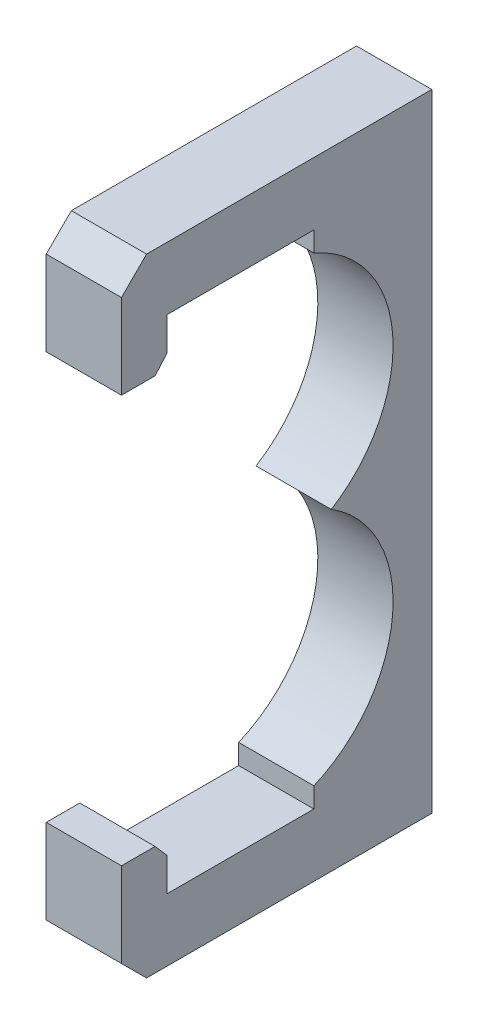
ISO-10303-21;
HEADER;
FILE_DESCRIPTION(('STEP AP214'),'2;1');
FILE_NAME('part.step','',(''),(''),'','','');
FILE_SCHEMA(('AUTOMOTIVE_DESIGN { 1 0 10303 214 1 1 1 1 }'));
ENDSEC;
DATA;
#1=APPLICATION_CONTEXT('core data for automotive mechanical design processes');
#2=APPLICATION_PROTOCOL_DEFINITION('international standard','automotive_design',2000,#1);
#3=PRODUCT_CONTEXT('',#1,'mechanical');
#4=PRODUCT('Part','Part','',(#3));
#5=PRODUCT_RELATED_PRODUCT_CATEGORY('part','',(#4));
#6=PRODUCT_DEFINITION_FORMATION('','',#4);
#7=PRODUCT_DEFINITION_CONTEXT('part definition',#1,'design');
#8=PRODUCT_DEFINITION('design','',#6,#7);
#9=PRODUCT_DEFINITION_SHAPE('','',#8);
#10=(LENGTH_UNIT() NAMED_UNIT(*) SI_UNIT(.MILLI.,.METRE.));
#11=(NAMED_UNIT(*) PLANE_ANGLE_UNIT() SI_UNIT($,.RADIAN.));
#12=(NAMED_UNIT(*) SI_UNIT($,.STERADIAN.) SOLID_ANGLE_UNIT());
#13=UNCERTAINTY_MEASURE_WITH_UNIT(LENGTH_MEASURE(1.E-05),#10,'distance_accuracy_value','');
#14=(GEOMETRIC_REPRESENTATION_CONTEXT(3) GLOBAL_UNCERTAINTY_ASSIGNED_CONTEXT((#13)) GLOBAL_UNIT_ASSIGNED_CONTEXT((#10,
#11,#12)) REPRESENTATION_CONTEXT('',''));
#15=CARTESIAN_POINT('',(0.,0.,0.));
#16=DIRECTION('',(0.,0.,1.));
#17=DIRECTION('',(1.,0.,0.));
#18=AXIS2_PLACEMENT_3D('',#15,#16,#17);
#19=CARTESIAN_POINT('',(6.,17.688911622081,-65.9487486966033));
#20=DIRECTION('',(0.,0.,1.));
#21=DIRECTION('',(1.,0.,0.));
#22=AXIS2_PLACEMENT_3D('',#19,#20,#21);
#23=PLANE('',#22);
#24=CARTESIAN_POINT('',(2.99999999999999,-29.6225357680315,-65.9487486966033));
#25=DIRECTION('',(0.,0.,-1.));
#26=DIRECTION('',(1.,0.,0.));
#27=AXIS2_PLACEMENT_3D('',#24,#25,#26);
#28=CIRCLE('',#27,1.25);
#29=CARTESIAN_POINT('',(4.24999999999999,-29.6225357680315,-65.9487486966033));
#30=VERTEX_POINT('',#29);
#31=EDGE_CURVE('E354',#30,#30,#28,.T.);
#32=ORIENTED_EDGE('',*,*,#31,.F.);
#33=EDGE_LOOP('',(#32));
#34=FACE_BOUND('',#33,.T.);
#35=CARTESIAN_POINT('',(2.99999999999999,15.188911622081,-65.9487486966033));
#36=DIRECTION('',(0.,0.,-1.));
#37=DIRECTION('',(-1.,0.,0.));
#38=AXIS2_PLACEMENT_3D('',#35,#36,#37);
#39=CIRCLE('',#38,1.25);
#40=CARTESIAN_POINT('',(1.74999999999999,15.188911622081,-65.9487486966033));
#41=VERTEX_POINT('',#40);
#42=EDGE_CURVE('E357',#41,#41,#39,.T.);
#43=ORIENTED_EDGE('',*,*,#42,.F.);
#44=EDGE_LOOP('',(#43));
#45=FACE_BOUND('',#44,.T.);
#46=DIRECTION('',(0.,1.,0.));
#47=VECTOR('',#46,1.);
#48=CARTESIAN_POINT('',(0.,17.688911622081,-65.9487486966033));
#49=LINE('',#48,#47);
#50=CARTESIAN_POINT('',(0.,-32.311088377919,-65.9487486966033));
#51=VERTEX_POINT('',#50);
#52=CARTESIAN_POINT('',(0.,17.688911622081,-65.9487486966033));
#53=VERTEX_POINT('',#52);
#54=EDGE_CURVE('E196',#51,#53,#49,.T.);
#55=ORIENTED_EDGE('',*,*,#54,.T.);
#56=DIRECTION('',(-1.,0.,0.));
#57=VECTOR('',#56,1.);
#58=CARTESIAN_POINT('',(6.,17.688911622081,-65.9487486966033));
#59=LINE('',#58,#57);
#60=CARTESIAN_POINT('',(6.,17.688911622081,-65.9487486966033));
#61=VERTEX_POINT('',#60);
#62=EDGE_CURVE('E11',#61,#53,#59,.T.);
#63=ORIENTED_EDGE('',*,*,#62,.F.);
#64=DIRECTION('',(0.,1.,0.));
#65=VECTOR('',#64,1.);
#66=CARTESIAN_POINT('',(6.,17.688911622081,-65.9487486966033));
#67=LINE('',#66,#65);
#68=CARTESIAN_POINT('',(6.,-32.311088377919,-65.9487486966033));
#69=VERTEX_POINT('',#68);
#70=EDGE_CURVE('E233',#69,#61,#67,.T.);
#71=ORIENTED_EDGE('',*,*,#70,.F.);
#72=DIRECTION('',(-1.,0.,0.));
#73=VECTOR('',#72,1.);
#74=CARTESIAN_POINT('',(6.,-32.311088377919,-65.9487486966033));
#75=LINE('',#74,#73);
#76=EDGE_CURVE('E192',#69,#51,#75,.T.);
#77=ORIENTED_EDGE('',*,*,#76,.T.);
#78=EDGE_LOOP('',(#55,#63,#71,#77));
#79=FACE_BOUND('',#78,.T.);
#80=ADVANCED_FACE('F34',(#34,#45,#79),#23,.F.);
#81=CARTESIAN_POINT('',(6.,17.688911622081,-43.2032051013806));
#82=DIRECTION('',(0.,-1.,0.));
#83=DIRECTION('',(0.,0.,-1.));
#84=AXIS2_PLACEMENT_3D('',#81,#82,#83);
#85=PLANE('',#84);
#86=DIRECTION('',(0.,0.,1.));
#87=VECTOR('',#86,1.);
#88=CARTESIAN_POINT('',(0.,17.688911622081,-43.2032051013806));
#89=LINE('',#88,#87);
#90=CARTESIAN_POINT('',(0.,17.688911622081,-43.2032051013806));
#91=VERTEX_POINT('',#90);
#92=EDGE_CURVE('E199',#53,#91,#89,.T.);
#93=ORIENTED_EDGE('',*,*,#92,.T.);
#94=DIRECTION('',(-1.,0.,0.));
#95=VECTOR('',#94,1.);
#96=CARTESIAN_POINT('',(6.,17.688911622081,-43.2032051013806));
#97=LINE('',#96,#95);
#98=CARTESIAN_POINT('',(6.,17.688911622081,-43.2032051013806));
#99=VERTEX_POINT('',#98);
#100=EDGE_CURVE('E42',#99,#91,#97,.T.);
#101=ORIENTED_EDGE('',*,*,#100,.F.);
#102=DIRECTION('',(0.,0.,1.));
#103=VECTOR('',#102,1.);
#104=CARTESIAN_POINT('',(6.,17.688911622081,-43.2032051013806));
#105=LINE('',#104,#103);
#106=EDGE_CURVE('E126',#61,#99,#105,.T.);
#107=ORIENTED_EDGE('',*,*,#106,.F.);
#108=ORIENTED_EDGE('',*,*,#62,.T.);
#109=EDGE_LOOP('',(#93,#101,#107,#108));
#110=FACE_BOUND('',#109,.T.);
#111=ADVANCED_FACE('F346',(#110),#85,.F.);
#112=CARTESIAN_POINT('',(6.,15.688911622081,-41.2032051013806));
#113=DIRECTION('',(0.,-0.707106781186548,-0.707106781186548));
#114=DIRECTION('',(0.,0.707106781186548,-0.707106781186548));
#115=AXIS2_PLACEMENT_3D('',#112,#113,#114);
#116=PLANE('',#115);
#117=DIRECTION('',(0.,-0.707106781186547,0.707106781186547));
#118=VECTOR('',#117,1.);
#119=CARTESIAN_POINT('',(0.,15.688911622081,-41.2032051013806));
#120=LINE('',#119,#118);
#121=CARTESIAN_POINT('',(0.,15.688911622081,-41.2032051013806));
#122=VERTEX_POINT('',#121);
#123=EDGE_CURVE('E202',#91,#122,#120,.T.);
#124=ORIENTED_EDGE('',*,*,#123,.T.);
#125=DIRECTION('',(-1.,0.,0.));
#126=VECTOR('',#125,1.);
#127=CARTESIAN_POINT('',(6.,15.688911622081,-41.2032051013806));
#128=LINE('',#127,#126);
#129=CARTESIAN_POINT('',(6.,15.688911622081,-41.2032051013806));
#130=VERTEX_POINT('',#129);
#131=EDGE_CURVE('E273',#130,#122,#128,.T.);
#132=ORIENTED_EDGE('',*,*,#131,.F.);
#133=DIRECTION('',(0.,-0.707106781186547,0.707106781186547));
#134=VECTOR('',#133,1.);
#135=CARTESIAN_POINT('',(6.,15.688911622081,-41.2032051013806));
#136=LINE('',#135,#134);
#137=EDGE_CURVE('E281',#99,#130,#136,.T.);
#138=ORIENTED_EDGE('',*,*,#137,.F.);
#139=ORIENTED_EDGE('',*,*,#100,.T.);
#140=EDGE_LOOP('',(#124,#132,#138,#139));
#141=FACE_BOUND('',#140,.T.);
#142=ADVANCED_FACE('F279',(#141),#116,.F.);
#143=CARTESIAN_POINT('',(6.,8.938911622081,-41.2032051013806));
#144=DIRECTION('',(0.,0.,-1.));
#145=DIRECTION('',(-1.,0.,0.));
#146=AXIS2_PLACEMENT_3D('',#143,#144,#145);
#147=PLANE('',#146);
#148=DIRECTION('',(0.,-1.,0.));
#149=VECTOR('',#148,1.);
#150=CARTESIAN_POINT('',(0.,8.938911622081,-41.2032051013806));
#151=LINE('',#150,#149);
#152=CARTESIAN_POINT('',(0.,8.938911622081,-41.2032051013806));
#153=VERTEX_POINT('',#152);
#154=EDGE_CURVE('E204',#122,#153,#151,.T.);
#155=ORIENTED_EDGE('',*,*,#154,.T.);
#156=DIRECTION('',(-1.,0.,0.));
#157=VECTOR('',#156,1.);
#158=CARTESIAN_POINT('',(6.,8.938911622081,-41.2032051013806));
#159=LINE('',#158,#157);
#160=CARTESIAN_POINT('',(6.,8.938911622081,-41.2032051013806));
#161=VERTEX_POINT('',#160);
#162=EDGE_CURVE('E270',#161,#153,#159,.T.);
#163=ORIENTED_EDGE('',*,*,#162,.F.);
#164=DIRECTION('',(0.,-1.,0.));
#165=VECTOR('',#164,1.);
#166=CARTESIAN_POINT('',(6.,8.938911622081,-41.2032051013806));
#167=LINE('',#166,#165);
#168=EDGE_CURVE('E299',#130,#161,#167,.T.);
#169=ORIENTED_EDGE('',*,*,#168,.F.);
#170=ORIENTED_EDGE('',*,*,#131,.T.);
#171=EDGE_LOOP('',(#155,#163,#169,#170));
#172=FACE_BOUND('',#171,.T.);
#173=ADVANCED_FACE('F290',(#172),#147,.F.);
#174=CARTESIAN_POINT('',(6.,8.938911622081,-41.2032051013806));
#175=DIRECTION('',(0.,1.,0.));
#176=DIRECTION('',(0.,0.,1.));
#177=AXIS2_PLACEMENT_3D('',#174,#175,#176);
#178=PLANE('',#177);
#179=DIRECTION('',(0.,0.,-1.));
#180=VECTOR('',#179,1.);
#181=CARTESIAN_POINT('',(0.,8.938911622081,-41.2032051013806));
#182=LINE('',#181,#180);
#183=CARTESIAN_POINT('',(0.,8.938911622081,-43.8801063311501));
#184=VERTEX_POINT('',#183);
#185=EDGE_CURVE('E206',#153,#184,#182,.T.);
#186=ORIENTED_EDGE('',*,*,#185,.T.);
#187=DIRECTION('',(-1.,0.,0.));
#188=VECTOR('',#187,1.);
#189=CARTESIAN_POINT('',(6.,8.938911622081,-43.8801063311501));
#190=LINE('',#189,#188);
#191=CARTESIAN_POINT('',(6.,8.938911622081,-43.8801063311501));
#192=VERTEX_POINT('',#191);
#193=EDGE_CURVE('E267',#192,#184,#190,.T.);
#194=ORIENTED_EDGE('',*,*,#193,.F.);
#195=DIRECTION('',(0.,0.,-1.));
#196=VECTOR('',#195,1.);
#197=CARTESIAN_POINT('',(6.,8.938911622081,-41.2032051013806));
#198=LINE('',#197,#196);
#199=EDGE_CURVE('E296',#161,#192,#198,.T.);
#200=ORIENTED_EDGE('',*,*,#199,.F.);
#201=ORIENTED_EDGE('',*,*,#162,.T.);
#202=EDGE_LOOP('',(#186,#194,#200,#201));
#203=FACE_BOUND('',#202,.T.);
#204=ADVANCED_FACE('F294',(#203),#178,.F.);
#205=CARTESIAN_POINT('',(6.,10.0114106212806,-44.8148552302697));
#206=DIRECTION('',(0.,0.657035261148567,0.753859844803684));
#207=DIRECTION('',(0.,-0.753859844803684,0.657035261148567));
#208=AXIS2_PLACEMENT_3D('',#205,#206,#207);
#209=PLANE('',#208);
#210=DIRECTION('',(0.,0.753859844803684,-0.657035261148567));
#211=VECTOR('',#210,1.);
#212=CARTESIAN_POINT('',(0.,10.0114106212806,-44.8148552302697));
#213=LINE('',#212,#211);
#214=CARTESIAN_POINT('',(0.,10.0114106212806,-44.8148552302697));
#215=VERTEX_POINT('',#214);
#216=EDGE_CURVE('E208',#184,#215,#213,.T.);
#217=ORIENTED_EDGE('',*,*,#216,.T.);
#218=DIRECTION('',(-1.,0.,0.));
#219=VECTOR('',#218,1.);
#220=CARTESIAN_POINT('',(6.,10.0114106212806,-44.8148552302697));
#221=LINE('',#220,#219);
#222=CARTESIAN_POINT('',(6.,10.0114106212806,-44.8148552302697));
#223=VERTEX_POINT('',#222);
#224=EDGE_CURVE('E264',#223,#215,#221,.T.);
#225=ORIENTED_EDGE('',*,*,#224,.F.);
#226=DIRECTION('',(0.,0.753859844803684,-0.657035261148567));
#227=VECTOR('',#226,1.);
#228=CARTESIAN_POINT('',(6.,10.0114106212806,-44.8148552302697));
#229=LINE('',#228,#227);
#230=EDGE_CURVE('E298',#192,#223,#229,.T.);
#231=ORIENTED_EDGE('',*,*,#230,.F.);
#232=ORIENTED_EDGE('',*,*,#193,.T.);
#233=EDGE_LOOP('',(#217,#225,#231,#232));
#234=FACE_BOUND('',#233,.T.);
#235=ADVANCED_FACE('F523',(#234),#209,.F.);
#236=CARTESIAN_POINT('',(6.,12.688911622081,-44.8148552302697));
#237=DIRECTION('',(0.,0.,1.));
#238=DIRECTION('',(1.,0.,0.));
#239=AXIS2_PLACEMENT_3D('',#236,#237,#238);
#240=PLANE('',#239);
#241=DIRECTION('',(0.,1.,0.));
#242=VECTOR('',#241,1.);
#243=CARTESIAN_POINT('',(0.,12.688911622081,-44.8148552302697));
#244=LINE('',#243,#242);
#245=CARTESIAN_POINT('',(0.,12.688911622081,-44.8148552302697));
#246=VERTEX_POINT('',#245);
#247=EDGE_CURVE('E210',#215,#246,#244,.T.);
#248=ORIENTED_EDGE('',*,*,#247,.T.);
#249=DIRECTION('',(-1.,0.,0.));
#250=VECTOR('',#249,1.);
#251=CARTESIAN_POINT('',(6.,12.688911622081,-44.8148552302697));
#252=LINE('',#251,#250);
#253=CARTESIAN_POINT('',(6.,12.688911622081,-44.8148552302697));
#254=VERTEX_POINT('',#253);
#255=EDGE_CURVE('E261',#254,#246,#252,.T.);
#256=ORIENTED_EDGE('',*,*,#255,.F.);
#257=DIRECTION('',(0.,1.,0.));
#258=VECTOR('',#257,1.);
#259=CARTESIAN_POINT('',(6.,12.688911622081,-44.8148552302697));
#260=LINE('',#259,#258);
#261=EDGE_CURVE('E301',#223,#254,#260,.T.);
#262=ORIENTED_EDGE('',*,*,#261,.F.);
#263=ORIENTED_EDGE('',*,*,#224,.T.);
#264=EDGE_LOOP('',(#248,#256,#262,#263));
#265=FACE_BOUND('',#264,.T.);
#266=ADVANCED_FACE('F514',(#265),#240,.F.);
#267=CARTESIAN_POINT('',(6.,12.688911622081,-44.8148552302697));
#268=DIRECTION('',(0.,1.,0.));
#269=DIRECTION('',(0.,0.,1.));
#270=AXIS2_PLACEMENT_3D('',#267,#268,#269);
#271=PLANE('',#270);
#272=DIRECTION('',(0.,0.,-1.));
#273=VECTOR('',#272,1.);
#274=CARTESIAN_POINT('',(0.,12.688911622081,-44.8148552302697));
#275=LINE('',#274,#273);
#276=CARTESIAN_POINT('',(0.,12.688911622081,-56.5479922725835));
#277=VERTEX_POINT('',#276);
#278=EDGE_CURVE('E212',#246,#277,#275,.T.);
#279=ORIENTED_EDGE('',*,*,#278,.T.);
#280=DIRECTION('',(-1.,0.,0.));
#281=VECTOR('',#280,1.);
#282=CARTESIAN_POINT('',(6.,12.688911622081,-56.5479922725835));
#283=LINE('',#282,#281);
#284=CARTESIAN_POINT('',(6.,12.688911622081,-56.5479922725835));
#285=VERTEX_POINT('',#284);
#286=EDGE_CURVE('E258',#285,#277,#283,.T.);
#287=ORIENTED_EDGE('',*,*,#286,.F.);
#288=DIRECTION('',(0.,0.,-1.));
#289=VECTOR('',#288,1.);
#290=CARTESIAN_POINT('',(6.,12.688911622081,-44.8148552302697));
#291=LINE('',#290,#289);
#292=EDGE_CURVE('E307',#254,#285,#291,.T.);
#293=ORIENTED_EDGE('',*,*,#292,.F.);
#294=ORIENTED_EDGE('',*,*,#255,.T.);
#295=EDGE_LOOP('',(#279,#287,#293,#294));
#296=FACE_BOUND('',#295,.T.);
#297=ADVANCED_FACE('F505',(#296),#271,.F.);
#298=CARTESIAN_POINT('',(6.,12.688911622081,-56.5479922725835));
#299=DIRECTION('',(0.,0.,-1.));
#300=DIRECTION('',(-1.,0.,0.));
#301=AXIS2_PLACEMENT_3D('',#298,#299,#300);
#302=PLANE('',#301);
#303=DIRECTION('',(0.,-1.,0.));
#304=VECTOR('',#303,1.);
#305=CARTESIAN_POINT('',(0.,12.688911622081,-56.5479922725835));
#306=LINE('',#305,#304);
#307=CARTESIAN_POINT('',(0.,11.0867852720392,-56.5479922725835));
#308=VERTEX_POINT('',#307);
#309=EDGE_CURVE('E214',#277,#308,#306,.T.);
#310=ORIENTED_EDGE('',*,*,#309,.T.);
#311=DIRECTION('',(-1.,0.,0.));
#312=VECTOR('',#311,1.);
#313=CARTESIAN_POINT('',(6.,11.0867852720392,-56.5479922725835));
#314=LINE('',#313,#312);
#315=CARTESIAN_POINT('',(6.,11.0867852720392,-56.5479922725835));
#316=VERTEX_POINT('',#315);
#317=EDGE_CURVE('E255',#316,#308,#314,.T.);
#318=ORIENTED_EDGE('',*,*,#317,.F.);
#319=DIRECTION('',(0.,-1.,0.));
#320=VECTOR('',#319,1.);
#321=CARTESIAN_POINT('',(6.,12.688911622081,-56.5479922725835));
#322=LINE('',#321,#320);
#323=EDGE_CURVE('E309',#285,#316,#322,.T.);
#324=ORIENTED_EDGE('',*,*,#323,.F.);
#325=ORIENTED_EDGE('',*,*,#286,.T.);
#326=EDGE_LOOP('',(#310,#318,#324,#325));
#327=FACE_BOUND('',#326,.T.);
#328=ADVANCED_FACE('F496',(#327),#302,.F.);
#329=CARTESIAN_POINT('',(6.,1.52856819024893,-52.4732051013806));
#330=DIRECTION('',(-1.,0.,0.));
#331=DIRECTION('',(0.,0.,1.));
#332=AXIS2_PLACEMENT_3D('',#329,#330,#331);
#333=CYLINDRICAL_SURFACE('',#332,10.3905439835086);
#334=CARTESIAN_POINT('',(0.,1.52856819024893,-52.4732051013806));
#335=DIRECTION('',(-1.,0.,0.));
#336=DIRECTION('',(0.,0.,-1.));
#337=AXIS2_PLACEMENT_3D('',#334,#335,#336);
#338=CIRCLE('',#337,10.3905439835086);
#339=CARTESIAN_POINT('',(0.,-7.311088377919,-57.934329164252));
#340=VERTEX_POINT('',#339);
#341=EDGE_CURVE('E216',#308,#340,#338,.T.);
#342=ORIENTED_EDGE('',*,*,#341,.T.);
#343=DIRECTION('',(-1.,0.,0.));
#344=VECTOR('',#343,1.);
#345=CARTESIAN_POINT('',(6.,-7.311088377919,-57.934329164252));
#346=LINE('',#345,#344);
#347=CARTESIAN_POINT('',(6.,-7.311088377919,-57.934329164252));
#348=VERTEX_POINT('',#347);
#349=EDGE_CURVE('E252',#348,#340,#346,.T.);
#350=ORIENTED_EDGE('',*,*,#349,.F.);
#351=CARTESIAN_POINT('',(6.,1.52856819024893,-52.4732051013806));
#352=DIRECTION('',(-1.,0.,0.));
#353=DIRECTION('',(0.,0.,-1.));
#354=AXIS2_PLACEMENT_3D('',#351,#352,#353);
#355=CIRCLE('',#354,10.3905439835086);
#356=EDGE_CURVE('E311',#316,#348,#355,.T.);
#357=ORIENTED_EDGE('',*,*,#356,.F.);
#358=ORIENTED_EDGE('',*,*,#317,.T.);
#359=EDGE_LOOP('',(#342,#350,#357,#358));
#360=FACE_BOUND('',#359,.T.);
#361=ADVANCED_FACE('F487',(#360),#333,.F.);
#362=CARTESIAN_POINT('',(6.,-16.1507449460869,-52.4732051013806));
#363=DIRECTION('',(-1.,0.,0.));
#364=DIRECTION('',(0.,0.,1.));
#365=AXIS2_PLACEMENT_3D('',#362,#363,#364);
#366=CYLINDRICAL_SURFACE('',#365,10.3905439835086);
#367=CARTESIAN_POINT('',(0.,-16.1507449460869,-52.4732051013806));
#368=DIRECTION('',(-1.,0.,0.));
#369=DIRECTION('',(0.,0.,1.));
#370=AXIS2_PLACEMENT_3D('',#367,#368,#369);
#371=CIRCLE('',#370,10.3905439835086);
#372=CARTESIAN_POINT('',(0.,-25.7089620278772,-56.5479922725835));
#373=VERTEX_POINT('',#372);
#374=EDGE_CURVE('E218',#340,#373,#371,.T.);
#375=ORIENTED_EDGE('',*,*,#374,.T.);
#376=DIRECTION('',(-1.,0.,0.));
#377=VECTOR('',#376,1.);
#378=CARTESIAN_POINT('',(6.,-25.7089620278772,-56.5479922725835));
#379=LINE('',#378,#377);
#380=CARTESIAN_POINT('',(6.,-25.7089620278772,-56.5479922725835));
#381=VERTEX_POINT('',#380);
#382=EDGE_CURVE('E249',#381,#373,#379,.T.);
#383=ORIENTED_EDGE('',*,*,#382,.F.);
#384=CARTESIAN_POINT('',(6.,-16.1507449460869,-52.4732051013806));
#385=DIRECTION('',(-1.,0.,0.));
#386=DIRECTION('',(0.,0.,1.));
#387=AXIS2_PLACEMENT_3D('',#384,#385,#386);
#388=CIRCLE('',#387,10.3905439835086);
#389=EDGE_CURVE('E313',#348,#381,#388,.T.);
#390=ORIENTED_EDGE('',*,*,#389,.F.);
#391=ORIENTED_EDGE('',*,*,#349,.T.);
#392=EDGE_LOOP('',(#375,#383,#390,#391));
#393=FACE_BOUND('',#392,.T.);
#394=ADVANCED_FACE('F478',(#393),#366,.F.);
#395=CARTESIAN_POINT('',(6.,-27.311088377919,-56.5479922725835));
#396=DIRECTION('',(0.,0.,-1.));
#397=DIRECTION('',(-1.,0.,0.));
#398=AXIS2_PLACEMENT_3D('',#395,#396,#397);
#399=PLANE('',#398);
#400=DIRECTION('',(0.,-1.,0.));
#401=VECTOR('',#400,1.);
#402=CARTESIAN_POINT('',(0.,-27.311088377919,-56.5479922725835));
#403=LINE('',#402,#401);
#404=CARTESIAN_POINT('',(0.,-27.311088377919,-56.5479922725835));
#405=VERTEX_POINT('',#404);
#406=EDGE_CURVE('E220',#373,#405,#403,.T.);
#407=ORIENTED_EDGE('',*,*,#406,.T.);
#408=DIRECTION('',(-1.,0.,0.));
#409=VECTOR('',#408,1.);
#410=CARTESIAN_POINT('',(6.,-27.311088377919,-56.5479922725835));
#411=LINE('',#410,#409);
#412=CARTESIAN_POINT('',(6.,-27.311088377919,-56.5479922725835));
#413=VERTEX_POINT('',#412);
#414=EDGE_CURVE('E246',#413,#405,#411,.T.);
#415=ORIENTED_EDGE('',*,*,#414,.F.);
#416=DIRECTION('',(0.,-1.,0.));
#417=VECTOR('',#416,1.);
#418=CARTESIAN_POINT('',(6.,-27.311088377919,-56.5479922725835));
#419=LINE('',#418,#417);
#420=EDGE_CURVE('E315',#381,#413,#419,.T.);
#421=ORIENTED_EDGE('',*,*,#420,.F.);
#422=ORIENTED_EDGE('',*,*,#382,.T.);
#423=EDGE_LOOP('',(#407,#415,#421,#422));
#424=FACE_BOUND('',#423,.T.);
#425=ADVANCED_FACE('F469',(#424),#399,.F.);
#426=CARTESIAN_POINT('',(6.,-27.311088377919,-44.8148552302697));
#427=DIRECTION('',(0.,-1.,0.));
#428=DIRECTION('',(0.,0.,-1.));
#429=AXIS2_PLACEMENT_3D('',#426,#427,#428);
#430=PLANE('',#429);
#431=DIRECTION('',(0.,0.,1.));
#432=VECTOR('',#431,1.);
#433=CARTESIAN_POINT('',(0.,-27.311088377919,-44.8148552302697));
#434=LINE('',#433,#432);
#435=CARTESIAN_POINT('',(0.,-27.311088377919,-44.8148552302697));
#436=VERTEX_POINT('',#435);
#437=EDGE_CURVE('E222',#405,#436,#434,.T.);
#438=ORIENTED_EDGE('',*,*,#437,.T.);
#439=DIRECTION('',(-1.,0.,0.));
#440=VECTOR('',#439,1.);
#441=CARTESIAN_POINT('',(6.,-27.311088377919,-44.8148552302697));
#442=LINE('',#441,#440);
#443=CARTESIAN_POINT('',(6.,-27.311088377919,-44.8148552302697));
#444=VERTEX_POINT('',#443);
#445=EDGE_CURVE('E243',#444,#436,#442,.T.);
#446=ORIENTED_EDGE('',*,*,#445,.F.);
#447=DIRECTION('',(0.,0.,1.));
#448=VECTOR('',#447,1.);
#449=CARTESIAN_POINT('',(6.,-27.311088377919,-44.8148552302697));
#450=LINE('',#449,#448);
#451=EDGE_CURVE('E317',#413,#444,#450,.T.);
#452=ORIENTED_EDGE('',*,*,#451,.F.);
#453=ORIENTED_EDGE('',*,*,#414,.T.);
#454=EDGE_LOOP('',(#438,#446,#452,#453));
#455=FACE_BOUND('',#454,.T.);
#456=ADVANCED_FACE('F460',(#455),#430,.F.);
#457=CARTESIAN_POINT('',(6.,-27.311088377919,-44.8148552302697));
#458=DIRECTION('',(0.,0.,1.));
#459=DIRECTION('',(1.,0.,0.));
#460=AXIS2_PLACEMENT_3D('',#457,#458,#459);
#461=PLANE('',#460);
#462=DIRECTION('',(0.,1.,0.));
#463=VECTOR('',#462,1.);
#464=CARTESIAN_POINT('',(0.,-27.311088377919,-44.8148552302697));
#465=LINE('',#464,#463);
#466=CARTESIAN_POINT('',(0.,-24.6335873771186,-44.8148552302697));
#467=VERTEX_POINT('',#466);
#468=EDGE_CURVE('E224',#436,#467,#465,.T.);
#469=ORIENTED_EDGE('',*,*,#468,.T.);
#470=DIRECTION('',(-1.,0.,0.));
#471=VECTOR('',#470,1.);
#472=CARTESIAN_POINT('',(6.,-24.6335873771186,-44.8148552302697));
#473=LINE('',#472,#471);
#474=CARTESIAN_POINT('',(6.,-24.6335873771186,-44.8148552302697));
#475=VERTEX_POINT('',#474);
#476=EDGE_CURVE('E240',#475,#467,#473,.T.);
#477=ORIENTED_EDGE('',*,*,#476,.F.);
#478=DIRECTION('',(0.,1.,0.));
#479=VECTOR('',#478,1.);
#480=CARTESIAN_POINT('',(6.,-27.311088377919,-44.8148552302697));
#481=LINE('',#480,#479);
#482=EDGE_CURVE('E319',#444,#475,#481,.T.);
#483=ORIENTED_EDGE('',*,*,#482,.F.);
#484=ORIENTED_EDGE('',*,*,#445,.T.);
#485=EDGE_LOOP('',(#469,#477,#483,#484));
#486=FACE_BOUND('',#485,.T.);
#487=ADVANCED_FACE('F452',(#486),#461,.F.);
#488=CARTESIAN_POINT('',(6.,-24.6335873771186,-44.8148552302697));
#489=DIRECTION('',(0.,-0.657035261148567,0.753859844803684));
#490=DIRECTION('',(0.,-0.753859844803684,-0.657035261148567));
#491=AXIS2_PLACEMENT_3D('',#488,#489,#490);
#492=PLANE('',#491);
#493=DIRECTION('',(0.,0.753859844803684,0.657035261148567));
#494=VECTOR('',#493,1.);
#495=CARTESIAN_POINT('',(0.,-24.6335873771186,-44.8148552302697));
#496=LINE('',#495,#494);
#497=CARTESIAN_POINT('',(0.,-23.561088377919,-43.8801063311501));
#498=VERTEX_POINT('',#497);
#499=EDGE_CURVE('E226',#467,#498,#496,.T.);
#500=ORIENTED_EDGE('',*,*,#499,.T.);
#501=DIRECTION('',(-1.,0.,0.));
#502=VECTOR('',#501,1.);
#503=CARTESIAN_POINT('',(6.,-23.561088377919,-43.8801063311501));
#504=LINE('',#503,#502);
#505=CARTESIAN_POINT('',(6.,-23.561088377919,-43.8801063311501));
#506=VERTEX_POINT('',#505);
#507=EDGE_CURVE('E237',#506,#498,#504,.T.);
#508=ORIENTED_EDGE('',*,*,#507,.F.);
#509=DIRECTION('',(0.,0.753859844803684,0.657035261148567));
#510=VECTOR('',#509,1.);
#511=CARTESIAN_POINT('',(6.,-24.6335873771186,-44.8148552302697));
#512=LINE('',#511,#510);
#513=EDGE_CURVE('E321',#475,#506,#512,.T.);
#514=ORIENTED_EDGE('',*,*,#513,.F.);
#515=ORIENTED_EDGE('',*,*,#476,.T.);
#516=EDGE_LOOP('',(#500,#508,#514,#515));
#517=FACE_BOUND('',#516,.T.);
#518=ADVANCED_FACE('F327',(#517),#492,.F.);
#519=CARTESIAN_POINT('',(6.,-23.561088377919,-41.2032051013806));
#520=DIRECTION('',(0.,-1.,0.));
#521=DIRECTION('',(0.,0.,-1.));
#522=AXIS2_PLACEMENT_3D('',#519,#520,#521);
#523=PLANE('',#522);
#524=DIRECTION('',(0.,0.,1.));
#525=VECTOR('',#524,1.);
#526=CARTESIAN_POINT('',(0.,-23.561088377919,-41.2032051013806));
#527=LINE('',#526,#525);
#528=CARTESIAN_POINT('',(0.,-23.561088377919,-41.2032051013806));
#529=VERTEX_POINT('',#528);
#530=EDGE_CURVE('E228',#498,#529,#527,.T.);
#531=ORIENTED_EDGE('',*,*,#530,.T.);
#532=DIRECTION('',(-1.,0.,0.));
#533=VECTOR('',#532,1.);
#534=CARTESIAN_POINT('',(6.,-23.561088377919,-41.2032051013806));
#535=LINE('',#534,#533);
#536=CARTESIAN_POINT('',(6.,-23.561088377919,-41.2032051013806));
#537=VERTEX_POINT('',#536);
#538=EDGE_CURVE('E187',#537,#529,#535,.T.);
#539=ORIENTED_EDGE('',*,*,#538,.F.);
#540=DIRECTION('',(0.,0.,1.));
#541=VECTOR('',#540,1.);
#542=CARTESIAN_POINT('',(6.,-23.561088377919,-41.2032051013806));
#543=LINE('',#542,#541);
#544=EDGE_CURVE('E178',#506,#537,#543,.T.);
#545=ORIENTED_EDGE('',*,*,#544,.F.);
#546=ORIENTED_EDGE('',*,*,#507,.T.);
#547=EDGE_LOOP('',(#531,#539,#545,#546));
#548=FACE_BOUND('',#547,.T.);
#549=ADVANCED_FACE('F331',(#548),#523,.F.);
#550=CARTESIAN_POINT('',(6.,-23.561088377919,-41.2032051013806));
#551=DIRECTION('',(0.,0.,-1.));
#552=DIRECTION('',(-1.,0.,0.));
#553=AXIS2_PLACEMENT_3D('',#550,#551,#552);
#554=PLANE('',#553);
#555=DIRECTION('',(0.,-1.,0.));
#556=VECTOR('',#555,1.);
#557=CARTESIAN_POINT('',(0.,-23.561088377919,-41.2032051013806));
#558=LINE('',#557,#556);
#559=CARTESIAN_POINT('',(0.,-30.311088377919,-41.2032051013806));
#560=VERTEX_POINT('',#559);
#561=EDGE_CURVE('E186',#529,#560,#558,.T.);
#562=ORIENTED_EDGE('',*,*,#561,.T.);
#563=DIRECTION('',(-1.,0.,0.));
#564=VECTOR('',#563,1.);
#565=CARTESIAN_POINT('',(6.,-30.311088377919,-41.2032051013806));
#566=LINE('',#565,#564);
#567=CARTESIAN_POINT('',(6.,-30.311088377919,-41.2032051013806));
#568=VERTEX_POINT('',#567);
#569=EDGE_CURVE('E183',#568,#560,#566,.T.);
#570=ORIENTED_EDGE('',*,*,#569,.F.);
#571=DIRECTION('',(0.,-1.,0.));
#572=VECTOR('',#571,1.);
#573=CARTESIAN_POINT('',(6.,-23.561088377919,-41.2032051013806));
#574=LINE('',#573,#572);
#575=EDGE_CURVE('E172',#537,#568,#574,.T.);
#576=ORIENTED_EDGE('',*,*,#575,.F.);
#577=ORIENTED_EDGE('',*,*,#538,.T.);
#578=EDGE_LOOP('',(#562,#570,#576,#577));
#579=FACE_BOUND('',#578,.T.);
#580=ADVANCED_FACE('F184',(#579),#554,.F.);
#581=CARTESIAN_POINT('',(6.,-30.311088377919,-41.2032051013806));
#582=DIRECTION('',(0.,0.707106781186548,-0.707106781186548));
#583=DIRECTION('',(0.,0.707106781186548,0.707106781186548));
#584=AXIS2_PLACEMENT_3D('',#581,#582,#583);
#585=PLANE('',#584);
#586=DIRECTION('',(0.,-0.707106781186547,-0.707106781186547));
#587=VECTOR('',#586,1.);
#588=CARTESIAN_POINT('',(0.,-30.311088377919,-41.2032051013806));
#589=LINE('',#588,#587);
#590=CARTESIAN_POINT('',(0.,-32.311088377919,-43.2032051013806));
#591=VERTEX_POINT('',#590);
#592=EDGE_CURVE('E112',#560,#591,#589,.T.);
#593=ORIENTED_EDGE('',*,*,#592,.T.);
#594=DIRECTION('',(-1.,0.,0.));
#595=VECTOR('',#594,1.);
#596=CARTESIAN_POINT('',(6.,-32.311088377919,-43.2032051013806));
#597=LINE('',#596,#595);
#598=CARTESIAN_POINT('',(6.,-32.311088377919,-43.2032051013806));
#599=VERTEX_POINT('',#598);
#600=EDGE_CURVE('E188',#599,#591,#597,.T.);
#601=ORIENTED_EDGE('',*,*,#600,.F.);
#602=DIRECTION('',(0.,-0.707106781186547,-0.707106781186547));
#603=VECTOR('',#602,1.);
#604=CARTESIAN_POINT('',(6.,-30.311088377919,-41.2032051013806));
#605=LINE('',#604,#603);
#606=EDGE_CURVE('E176',#568,#599,#605,.T.);
#607=ORIENTED_EDGE('',*,*,#606,.F.);
#608=ORIENTED_EDGE('',*,*,#569,.T.);
#609=EDGE_LOOP('',(#593,#601,#607,#608));
#610=FACE_BOUND('',#609,.T.);
#611=ADVANCED_FACE('F190',(#610),#585,.F.);
#612=CARTESIAN_POINT('',(6.,-32.311088377919,-43.2032051013806));
#613=DIRECTION('',(0.,1.,0.));
#614=DIRECTION('',(0.,0.,1.));
#615=AXIS2_PLACEMENT_3D('',#612,#613,#614);
#616=PLANE('',#615);
#617=DIRECTION('',(0.,0.,-1.));
#618=VECTOR('',#617,1.);
#619=CARTESIAN_POINT('',(0.,-32.311088377919,-43.2032051013806));
#620=LINE('',#619,#618);
#621=EDGE_CURVE('E118',#591,#51,#620,.T.);
#622=ORIENTED_EDGE('',*,*,#621,.T.);
#623=ORIENTED_EDGE('',*,*,#76,.F.);
#624=DIRECTION('',(0.,0.,-1.));
#625=VECTOR('',#624,1.);
#626=CARTESIAN_POINT('',(6.,-32.311088377919,-43.2032051013806));
#627=LINE('',#626,#625);
#628=EDGE_CURVE('E50',#599,#69,#627,.T.);
#629=ORIENTED_EDGE('',*,*,#628,.F.);
#630=ORIENTED_EDGE('',*,*,#600,.T.);
#631=EDGE_LOOP('',(#622,#623,#629,#630));
#632=FACE_BOUND('',#631,.T.);
#633=ADVANCED_FACE('F335',(#632),#616,.F.);
#634=CARTESIAN_POINT('',(6.,-16.1507449460869,-52.4732051013806));
#635=DIRECTION('',(-1.,0.,0.));
#636=DIRECTION('',(0.,0.,1.));
#637=AXIS2_PLACEMENT_3D('',#634,#635,#636);
#638=PLANE('',#637);
#639=ORIENTED_EDGE('',*,*,#70,.T.);
#640=ORIENTED_EDGE('',*,*,#106,.T.);
#641=ORIENTED_EDGE('',*,*,#137,.T.);
#642=ORIENTED_EDGE('',*,*,#168,.T.);
#643=ORIENTED_EDGE('',*,*,#199,.T.);
#644=ORIENTED_EDGE('',*,*,#230,.T.);
#645=ORIENTED_EDGE('',*,*,#261,.T.);
#646=ORIENTED_EDGE('',*,*,#292,.T.);
#647=ORIENTED_EDGE('',*,*,#323,.T.);
#648=ORIENTED_EDGE('',*,*,#356,.T.);
#649=ORIENTED_EDGE('',*,*,#389,.T.);
#650=ORIENTED_EDGE('',*,*,#420,.T.);
#651=ORIENTED_EDGE('',*,*,#451,.T.);
#652=ORIENTED_EDGE('',*,*,#482,.T.);
#653=ORIENTED_EDGE('',*,*,#513,.T.);
#654=ORIENTED_EDGE('',*,*,#544,.T.);
#655=ORIENTED_EDGE('',*,*,#575,.T.);
#656=ORIENTED_EDGE('',*,*,#606,.T.);
#657=ORIENTED_EDGE('',*,*,#628,.T.);
#658=EDGE_LOOP('',(#639,#640,#641,#642,#643,#644,#645,#646,#647,#648,#649,#650,#651,#652,#653,
#654,#655,#656,#657));
#659=FACE_BOUND('',#658,.T.);
#660=ADVANCED_FACE('F174',(#659),#638,.F.);
#661=CARTESIAN_POINT('',(0.,-16.1507449460869,-52.4732051013806));
#662=DIRECTION('',(-1.,0.,0.));
#663=DIRECTION('',(0.,0.,1.));
#664=AXIS2_PLACEMENT_3D('',#661,#662,#663);
#665=PLANE('',#664);
#666=ORIENTED_EDGE('',*,*,#54,.F.);
#667=ORIENTED_EDGE('',*,*,#621,.F.);
#668=ORIENTED_EDGE('',*,*,#592,.F.);
#669=ORIENTED_EDGE('',*,*,#561,.F.);
#670=ORIENTED_EDGE('',*,*,#530,.F.);
#671=ORIENTED_EDGE('',*,*,#499,.F.);
#672=ORIENTED_EDGE('',*,*,#468,.F.);
#673=ORIENTED_EDGE('',*,*,#437,.F.);
#674=ORIENTED_EDGE('',*,*,#406,.F.);
#675=ORIENTED_EDGE('',*,*,#374,.F.);
#676=ORIENTED_EDGE('',*,*,#341,.F.);
#677=ORIENTED_EDGE('',*,*,#309,.F.);
#678=ORIENTED_EDGE('',*,*,#278,.F.);
#679=ORIENTED_EDGE('',*,*,#247,.F.);
#680=ORIENTED_EDGE('',*,*,#216,.F.);
#681=ORIENTED_EDGE('',*,*,#185,.F.);
#682=ORIENTED_EDGE('',*,*,#154,.F.);
#683=ORIENTED_EDGE('',*,*,#123,.F.);
#684=ORIENTED_EDGE('',*,*,#92,.F.);
#685=EDGE_LOOP('',(#666,#667,#668,#669,#670,#671,#672,#673,#674,#675,#676,#677,#678,#679,#680,
#681,#682,#683,#684));
#686=FACE_BOUND('',#685,.T.);
#687=ADVANCED_FACE('F285',(#686),#665,.T.);
#688=CARTESIAN_POINT('',(2.99999999999999,15.188911622081,-59.9487486966033));
#689=DIRECTION('',(0.,0.,-1.));
#690=DIRECTION('',(-1.,0.,0.));
#691=AXIS2_PLACEMENT_3D('',#688,#689,#690);
#692=CYLINDRICAL_SURFACE('',#691,1.25);
#693=CARTESIAN_POINT('',(2.99999999999999,15.188911622081,-59.9487486966033));
#694=DIRECTION('',(0.,0.,-1.));
#695=DIRECTION('',(-1.,0.,0.));
#696=AXIS2_PLACEMENT_3D('',#693,#694,#695);
#697=CIRCLE('',#696,1.25);
#698=CARTESIAN_POINT('',(1.74999999999999,15.188911622081,-59.9487486966033));
#699=VERTEX_POINT('',#698);
#700=EDGE_CURVE('E200',#699,#699,#697,.T.);
#701=ORIENTED_EDGE('',*,*,#700,.F.);
#702=EDGE_LOOP('',(#701));
#703=FACE_BOUND('',#702,.T.);
#704=ORIENTED_EDGE('',*,*,#42,.T.);
#705=EDGE_LOOP('',(#704));
#706=FACE_BOUND('',#705,.T.);
#707=ADVANCED_FACE('F381',(#703,#706),#692,.F.);
#708=CARTESIAN_POINT('',(2.99999999999999,15.188911622081,-59.9487486966033));
#709=DIRECTION('',(0.,0.,-1.));
#710=DIRECTION('',(-1.,0.,0.));
#711=AXIS2_PLACEMENT_3D('',#708,#709,#710);
#712=PLANE('',#711);
#713=ORIENTED_EDGE('',*,*,#700,.T.);
#714=EDGE_LOOP('',(#713));
#715=FACE_BOUND('',#714,.T.);
#716=ADVANCED_FACE('F372',(#715),#712,.T.);
#717=CARTESIAN_POINT('',(2.99999999999999,-29.6225357680315,-59.9487486966033));
#718=DIRECTION('',(0.,0.,-1.));
#719=DIRECTION('',(-1.,0.,0.));
#720=AXIS2_PLACEMENT_3D('',#717,#718,#719);
#721=CYLINDRICAL_SURFACE('',#720,1.25);
#722=CARTESIAN_POINT('',(2.99999999999999,-29.6225357680315,-59.9487486966033));
#723=DIRECTION('',(0.,0.,-1.));
#724=DIRECTION('',(1.,0.,0.));
#725=AXIS2_PLACEMENT_3D('',#722,#723,#724);
#726=CIRCLE('',#725,1.25);
#727=CARTESIAN_POINT('',(4.24999999999999,-29.6225357680315,-59.9487486966033));
#728=VERTEX_POINT('',#727);
#729=EDGE_CURVE('E359',#728,#728,#726,.T.);
#730=ORIENTED_EDGE('',*,*,#729,.F.);
#731=EDGE_LOOP('',(#730));
#732=FACE_BOUND('',#731,.T.);
#733=ORIENTED_EDGE('',*,*,#31,.T.);
#734=EDGE_LOOP('',(#733));
#735=FACE_BOUND('',#734,.T.);
#736=ADVANCED_FACE('F369',(#732,#735),#721,.F.);
#737=CARTESIAN_POINT('',(2.99999999999999,-29.6225357680315,-59.9487486966033));
#738=DIRECTION('',(0.,0.,1.));
#739=DIRECTION('',(1.,0.,0.));
#740=AXIS2_PLACEMENT_3D('',#737,#738,#739);
#741=PLANE('',#740);
#742=ORIENTED_EDGE('',*,*,#729,.T.);
#743=EDGE_LOOP('',(#742));
#744=FACE_BOUND('',#743,.T.);
#745=ADVANCED_FACE('F371',(#744),#741,.F.);
#746=CLOSED_SHELL('',(#80,#111,#142,#173,#204,#235,#266,#297,#328,#361,#394,#425,#456,#487,#518,
#549,#580,#611,#633,#660,#687,#707,#716,#736,#745));
#747=MANIFOLD_SOLID_BREP('B2',#746);
#748=ADVANCED_BREP_SHAPE_REPRESENTATION('',(#18,#747),#14);
#749=SHAPE_DEFINITION_REPRESENTATION(#9,#748);
ENDSEC;
END-ISO-10303-21;
